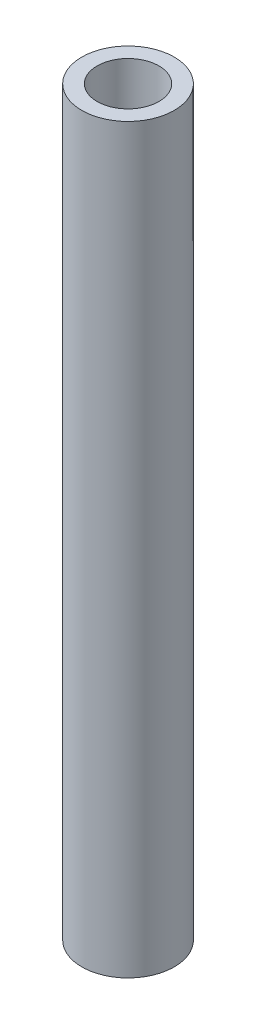
ISO-10303-21;
HEADER;
FILE_DESCRIPTION(('STEP AP214'),'2;1');
FILE_NAME('part.step','',(''),(''),'','','');
FILE_SCHEMA(('AUTOMOTIVE_DESIGN { 1 0 10303 214 1 1 1 1 }'));
ENDSEC;
DATA;
#1=APPLICATION_CONTEXT('core data for automotive mechanical design processes');
#2=APPLICATION_PROTOCOL_DEFINITION('international standard','automotive_design',2000,#1);
#3=PRODUCT_CONTEXT('',#1,'mechanical');
#4=PRODUCT('Part','Part','',(#3));
#5=PRODUCT_RELATED_PRODUCT_CATEGORY('part','',(#4));
#6=PRODUCT_DEFINITION_FORMATION('','',#4);
#7=PRODUCT_DEFINITION_CONTEXT('part definition',#1,'design');
#8=PRODUCT_DEFINITION('design','',#6,#7);
#9=PRODUCT_DEFINITION_SHAPE('','',#8);
#10=(LENGTH_UNIT() NAMED_UNIT(*) SI_UNIT(.MILLI.,.METRE.));
#11=(NAMED_UNIT(*) PLANE_ANGLE_UNIT() SI_UNIT($,.RADIAN.));
#12=(NAMED_UNIT(*) SI_UNIT($,.STERADIAN.) SOLID_ANGLE_UNIT());
#13=UNCERTAINTY_MEASURE_WITH_UNIT(LENGTH_MEASURE(1.E-05),#10,'distance_accuracy_value','');
#14=(GEOMETRIC_REPRESENTATION_CONTEXT(3) GLOBAL_UNCERTAINTY_ASSIGNED_CONTEXT((#13)) GLOBAL_UNIT_ASSIGNED_CONTEXT((#10,
#11,#12)) REPRESENTATION_CONTEXT('',''));
#15=CARTESIAN_POINT('',(0.,0.,0.));
#16=DIRECTION('',(0.,0.,1.));
#17=DIRECTION('',(1.,0.,0.));
#18=AXIS2_PLACEMENT_3D('',#15,#16,#17);
#19=CARTESIAN_POINT('',(0.,38.1,0.));
#20=DIRECTION('',(0.,-1.,0.));
#21=DIRECTION('',(0.,0.,-1.));
#22=AXIS2_PLACEMENT_3D('',#19,#20,#21);
#23=CYLINDRICAL_SURFACE('',#22,2.3749);
#24=CARTESIAN_POINT('',(0.,38.1,0.));
#25=DIRECTION('',(0.,1.,0.));
#26=DIRECTION('',(0.,0.,1.));
#27=AXIS2_PLACEMENT_3D('',#24,#25,#26);
#28=CIRCLE('',#27,2.3749);
#29=CARTESIAN_POINT('',(0.,38.1,-2.3749));
#30=VERTEX_POINT('',#29);
#31=EDGE_CURVE('E10',#30,#30,#28,.T.);
#32=CARTESIAN_POINT('',(0.,0.,0.));
#33=DIRECTION('',(0.,1.,0.));
#34=DIRECTION('',(0.,0.,1.));
#35=AXIS2_PLACEMENT_3D('',#32,#33,#34);
#36=CIRCLE('',#35,2.3749);
#37=CARTESIAN_POINT('',(0.,0.,-2.3749));
#38=VERTEX_POINT('',#37);
#39=EDGE_CURVE('E40',#38,#38,#36,.T.);
#40=CARTESIAN_POINT('',(0.,38.1,-2.3749));
#41=CARTESIAN_POINT('',(0.,37.703125,-2.3749));
#42=CARTESIAN_POINT('',(0.,37.30625,-2.3749));
#43=CARTESIAN_POINT('',(0.,36.5125,-2.3749));
#44=CARTESIAN_POINT('',(0.,36.115625,-2.3749));
#45=CARTESIAN_POINT('',(0.,35.321875,-2.3749));
#46=CARTESIAN_POINT('',(0.,34.925,-2.3749));
#47=CARTESIAN_POINT('',(0.,34.13125,-2.3749));
#48=CARTESIAN_POINT('',(0.,33.734375,-2.3749));
#49=CARTESIAN_POINT('',(0.,32.940625,-2.3749));
#50=CARTESIAN_POINT('',(0.,32.54375,-2.3749));
#51=CARTESIAN_POINT('',(0.,31.75,-2.3749));
#52=CARTESIAN_POINT('',(0.,31.353125,-2.3749));
#53=CARTESIAN_POINT('',(0.,30.559375,-2.3749));
#54=CARTESIAN_POINT('',(0.,30.1625,-2.3749));
#55=CARTESIAN_POINT('',(0.,29.36875,-2.3749));
#56=CARTESIAN_POINT('',(0.,28.971875,-2.3749));
#57=CARTESIAN_POINT('',(0.,28.178125,-2.3749));
#58=CARTESIAN_POINT('',(0.,27.78125,-2.3749));
#59=CARTESIAN_POINT('',(0.,26.9875,-2.3749));
#60=CARTESIAN_POINT('',(0.,26.590625,-2.3749));
#61=CARTESIAN_POINT('',(0.,25.796875,-2.3749));
#62=CARTESIAN_POINT('',(0.,25.4,-2.3749));
#63=CARTESIAN_POINT('',(0.,24.60625,-2.3749));
#64=CARTESIAN_POINT('',(0.,24.209375,-2.3749));
#65=CARTESIAN_POINT('',(0.,23.415625,-2.3749));
#66=CARTESIAN_POINT('',(0.,23.01875,-2.3749));
#67=CARTESIAN_POINT('',(0.,22.225,-2.3749));
#68=CARTESIAN_POINT('',(0.,21.828125,-2.3749));
#69=CARTESIAN_POINT('',(0.,21.034375,-2.3749));
#70=CARTESIAN_POINT('',(0.,20.6375,-2.3749));
#71=CARTESIAN_POINT('',(0.,19.84375,-2.3749));
#72=CARTESIAN_POINT('',(0.,19.446875,-2.3749));
#73=CARTESIAN_POINT('',(0.,18.653125,-2.3749));
#74=CARTESIAN_POINT('',(0.,18.25625,-2.3749));
#75=CARTESIAN_POINT('',(0.,17.4625,-2.3749));
#76=CARTESIAN_POINT('',(0.,17.065625,-2.3749));
#77=CARTESIAN_POINT('',(0.,16.271875,-2.3749));
#78=CARTESIAN_POINT('',(0.,15.875,-2.3749));
#79=CARTESIAN_POINT('',(0.,15.08125,-2.3749));
#80=CARTESIAN_POINT('',(0.,14.684375,-2.3749));
#81=CARTESIAN_POINT('',(0.,13.890625,-2.3749));
#82=CARTESIAN_POINT('',(0.,13.49375,-2.3749));
#83=CARTESIAN_POINT('',(0.,12.7,-2.3749));
#84=CARTESIAN_POINT('',(0.,12.303125,-2.3749));
#85=CARTESIAN_POINT('',(0.,11.509375,-2.3749));
#86=CARTESIAN_POINT('',(0.,11.1125,-2.3749));
#87=CARTESIAN_POINT('',(0.,10.31875,-2.3749));
#88=CARTESIAN_POINT('',(0.,9.921875,-2.3749));
#89=CARTESIAN_POINT('',(0.,9.128125,-2.3749));
#90=CARTESIAN_POINT('',(0.,8.73125,-2.3749));
#91=CARTESIAN_POINT('',(0.,7.9375,-2.3749));
#92=CARTESIAN_POINT('',(0.,7.540625,-2.3749));
#93=CARTESIAN_POINT('',(0.,6.746875,-2.3749));
#94=CARTESIAN_POINT('',(0.,6.35,-2.3749));
#95=CARTESIAN_POINT('',(0.,5.55625,-2.3749));
#96=CARTESIAN_POINT('',(0.,5.159375,-2.3749));
#97=CARTESIAN_POINT('',(0.,4.365625,-2.3749));
#98=CARTESIAN_POINT('',(0.,3.96875,-2.3749));
#99=CARTESIAN_POINT('',(0.,3.175,-2.3749));
#100=CARTESIAN_POINT('',(0.,2.778125,-2.3749));
#101=CARTESIAN_POINT('',(0.,1.984375,-2.3749));
#102=CARTESIAN_POINT('',(0.,1.5875,-2.3749));
#103=CARTESIAN_POINT('',(0.,0.79375,-2.3749));
#104=CARTESIAN_POINT('',(0.,0.396875,-2.3749));
#105=CARTESIAN_POINT('',(0.,0.,-2.3749));
#106=B_SPLINE_CURVE_WITH_KNOTS('',3,(#40,#41,#42,#43,#44,#45,#46,#47,#48,#49,#50,#51,#52,#53,
#54,#55,#56,#57,#58,#59,#60,#61,#62,#63,#64,#65,#66,#67,#68,#69,#70,#71,#72,#73,#74,#75,#76,#77,
#78,#79,#80,#81,#82,#83,#84,#85,#86,#87,#88,#89,#90,#91,#92,#93,#94,#95,#96,#97,#98,#99,#100,
#101,#102,#103,#104,#105),.UNSPECIFIED.,.F.,.F.,(4,2,2,2,2,2,2,2,2,2,2,2,2,2,2,2,2,2,2,2,2,2,2,
2,2,2,2,2,2,2,2,2,4),(0.,1.19062499999999,2.38124999999999,3.571875,4.7625,5.953125,7.14375,
8.33437499999999,9.525,10.715625,11.90625,13.096875,14.2875,15.478125,16.66875,17.859375,19.05,
20.240625,21.43125,22.621875,23.8125,25.003125,26.19375,27.384375,28.575,29.765625,30.95625,
32.146875,33.3375,34.528125,35.71875,36.909375,38.1),.UNSPECIFIED.);
#107=EDGE_CURVE('BSEAM37',#30,#38,#106,.T.);
#108=ORIENTED_EDGE('',*,*,#31,.F.);
#109=ORIENTED_EDGE('',*,*,#39,.T.);
#110=ORIENTED_EDGE('',*,*,#107,.T.);
#111=ORIENTED_EDGE('',*,*,#107,.F.);
#112=EDGE_LOOP('',(#108,#110,#109,#111));
#113=FACE_BOUND('',#112,.T.);
#114=ADVANCED_FACE('F37',(#113),#23,.T.);
#115=CARTESIAN_POINT('',(0.,38.1,0.));
#116=DIRECTION('',(0.,1.,0.));
#117=DIRECTION('',(0.,0.,1.));
#118=AXIS2_PLACEMENT_3D('',#115,#116,#117);
#119=PLANE('',#118);
#120=CARTESIAN_POINT('',(0.,38.1,0.));
#121=DIRECTION('',(0.,1.,0.));
#122=DIRECTION('',(0.,0.,1.));
#123=AXIS2_PLACEMENT_3D('',#120,#121,#122);
#124=CIRCLE('',#123,1.5875);
#125=CARTESIAN_POINT('',(0.,38.1,1.5875));
#126=VERTEX_POINT('',#125);
#127=EDGE_CURVE('E51',#126,#126,#124,.T.);
#128=ORIENTED_EDGE('',*,*,#127,.F.);
#129=EDGE_LOOP('',(#128));
#130=FACE_BOUND('',#129,.T.);
#131=ORIENTED_EDGE('',*,*,#31,.T.);
#132=EDGE_LOOP('',(#131));
#133=FACE_BOUND('',#132,.T.);
#134=ADVANCED_FACE('F68',(#130,#133),#119,.T.);
#135=CARTESIAN_POINT('',(0.,0.,0.));
#136=DIRECTION('',(0.,1.,0.));
#137=DIRECTION('',(0.,0.,1.));
#138=AXIS2_PLACEMENT_3D('',#135,#136,#137);
#139=PLANE('',#138);
#140=CARTESIAN_POINT('',(0.,0.,0.));
#141=DIRECTION('',(0.,1.,0.));
#142=DIRECTION('',(0.,0.,1.));
#143=AXIS2_PLACEMENT_3D('',#140,#141,#142);
#144=CIRCLE('',#143,1.5875);
#145=CARTESIAN_POINT('',(0.,0.,1.5875));
#146=VERTEX_POINT('',#145);
#147=EDGE_CURVE('E49',#146,#146,#144,.T.);
#148=ORIENTED_EDGE('',*,*,#147,.T.);
#149=EDGE_LOOP('',(#148));
#150=FACE_BOUND('',#149,.T.);
#151=ORIENTED_EDGE('',*,*,#39,.F.);
#152=EDGE_LOOP('',(#151));
#153=FACE_BOUND('',#152,.T.);
#154=ADVANCED_FACE('F59',(#150,#153),#139,.F.);
#155=CARTESIAN_POINT('',(0.,0.,0.));
#156=DIRECTION('',(0.,1.,0.));
#157=DIRECTION('',(0.,0.,1.));
#158=AXIS2_PLACEMENT_3D('',#155,#156,#157);
#159=CYLINDRICAL_SURFACE('',#158,1.5875);
#160=CARTESIAN_POINT('',(0.,0.,1.5875));
#161=CARTESIAN_POINT('',(0.,0.396875,1.5875));
#162=CARTESIAN_POINT('',(0.,0.79375,1.5875));
#163=CARTESIAN_POINT('',(0.,1.5875,1.5875));
#164=CARTESIAN_POINT('',(0.,1.984375,1.5875));
#165=CARTESIAN_POINT('',(0.,2.778125,1.5875));
#166=CARTESIAN_POINT('',(0.,3.175,1.5875));
#167=CARTESIAN_POINT('',(0.,3.96875,1.5875));
#168=CARTESIAN_POINT('',(0.,4.365625,1.5875));
#169=CARTESIAN_POINT('',(0.,5.159375,1.5875));
#170=CARTESIAN_POINT('',(0.,5.55625,1.5875));
#171=CARTESIAN_POINT('',(0.,6.35,1.5875));
#172=CARTESIAN_POINT('',(0.,6.746875,1.5875));
#173=CARTESIAN_POINT('',(0.,7.540625,1.5875));
#174=CARTESIAN_POINT('',(0.,7.9375,1.5875));
#175=CARTESIAN_POINT('',(0.,8.73125,1.5875));
#176=CARTESIAN_POINT('',(0.,9.128125,1.5875));
#177=CARTESIAN_POINT('',(0.,9.921875,1.5875));
#178=CARTESIAN_POINT('',(0.,10.31875,1.5875));
#179=CARTESIAN_POINT('',(0.,11.1125,1.5875));
#180=CARTESIAN_POINT('',(0.,11.509375,1.5875));
#181=CARTESIAN_POINT('',(0.,12.303125,1.5875));
#182=CARTESIAN_POINT('',(0.,12.7,1.5875));
#183=CARTESIAN_POINT('',(0.,13.49375,1.5875));
#184=CARTESIAN_POINT('',(0.,13.890625,1.5875));
#185=CARTESIAN_POINT('',(0.,14.684375,1.5875));
#186=CARTESIAN_POINT('',(0.,15.08125,1.5875));
#187=CARTESIAN_POINT('',(0.,15.875,1.5875));
#188=CARTESIAN_POINT('',(0.,16.271875,1.5875));
#189=CARTESIAN_POINT('',(0.,17.065625,1.5875));
#190=CARTESIAN_POINT('',(0.,17.4625,1.5875));
#191=CARTESIAN_POINT('',(0.,18.25625,1.5875));
#192=CARTESIAN_POINT('',(0.,18.653125,1.5875));
#193=CARTESIAN_POINT('',(0.,19.446875,1.5875));
#194=CARTESIAN_POINT('',(0.,19.84375,1.5875));
#195=CARTESIAN_POINT('',(0.,20.6375,1.5875));
#196=CARTESIAN_POINT('',(0.,21.034375,1.5875));
#197=CARTESIAN_POINT('',(0.,21.828125,1.5875));
#198=CARTESIAN_POINT('',(0.,22.225,1.5875));
#199=CARTESIAN_POINT('',(0.,23.01875,1.5875));
#200=CARTESIAN_POINT('',(0.,23.415625,1.5875));
#201=CARTESIAN_POINT('',(0.,24.209375,1.5875));
#202=CARTESIAN_POINT('',(0.,24.60625,1.5875));
#203=CARTESIAN_POINT('',(0.,25.4,1.5875));
#204=CARTESIAN_POINT('',(0.,25.796875,1.5875));
#205=CARTESIAN_POINT('',(0.,26.590625,1.5875));
#206=CARTESIAN_POINT('',(0.,26.9875,1.5875));
#207=CARTESIAN_POINT('',(0.,27.78125,1.5875));
#208=CARTESIAN_POINT('',(0.,28.178125,1.5875));
#209=CARTESIAN_POINT('',(0.,28.971875,1.5875));
#210=CARTESIAN_POINT('',(0.,29.36875,1.5875));
#211=CARTESIAN_POINT('',(0.,30.1625,1.5875));
#212=CARTESIAN_POINT('',(0.,30.559375,1.5875));
#213=CARTESIAN_POINT('',(0.,31.353125,1.5875));
#214=CARTESIAN_POINT('',(0.,31.75,1.5875));
#215=CARTESIAN_POINT('',(0.,32.54375,1.5875));
#216=CARTESIAN_POINT('',(0.,32.940625,1.5875));
#217=CARTESIAN_POINT('',(0.,33.734375,1.5875));
#218=CARTESIAN_POINT('',(0.,34.13125,1.5875));
#219=CARTESIAN_POINT('',(0.,34.925,1.5875));
#220=CARTESIAN_POINT('',(0.,35.321875,1.5875));
#221=CARTESIAN_POINT('',(0.,36.115625,1.5875));
#222=CARTESIAN_POINT('',(0.,36.5125,1.5875));
#223=CARTESIAN_POINT('',(0.,37.30625,1.5875));
#224=CARTESIAN_POINT('',(0.,37.703125,1.5875));
#225=CARTESIAN_POINT('',(0.,38.1,1.5875));
#226=B_SPLINE_CURVE_WITH_KNOTS('',3,(#160,#161,#162,#163,#164,#165,#166,#167,#168,#169,#170,
#171,#172,#173,#174,#175,#176,#177,#178,#179,#180,#181,#182,#183,#184,#185,#186,#187,#188,#189,
#190,#191,#192,#193,#194,#195,#196,#197,#198,#199,#200,#201,#202,#203,#204,#205,#206,#207,#208,
#209,#210,#211,#212,#213,#214,#215,#216,#217,#218,#219,#220,#221,#222,#223,#224,#225),
.UNSPECIFIED.,.F.,.F.,(4,2,2,2,2,2,2,2,2,2,2,2,2,2,2,2,2,2,2,2,2,2,2,2,2,2,2,2,2,2,2,2,4),(0.,
1.190625,2.38125,3.571875,4.7625,5.953125,7.14375,8.334375,9.525,10.715625,11.90625,13.096875,
14.2875,15.478125,16.66875,17.859375,19.05,20.240625,21.43125,22.621875,23.8125,25.003125,
26.19375,27.384375,28.575,29.765625,30.95625,32.146875,33.3375,34.528125,35.71875,36.909375,
38.1),.UNSPECIFIED.);
#227=EDGE_CURVE('BSEAM62',#146,#126,#226,.T.);
#228=ORIENTED_EDGE('',*,*,#147,.F.);
#229=ORIENTED_EDGE('',*,*,#127,.T.);
#230=ORIENTED_EDGE('',*,*,#227,.T.);
#231=ORIENTED_EDGE('',*,*,#227,.F.);
#232=EDGE_LOOP('',(#228,#230,#229,#231));
#233=FACE_BOUND('',#232,.T.);
#234=ADVANCED_FACE('F62',(#233),#159,.F.);
#235=CLOSED_SHELL('',(#114,#134,#154,#234));
#236=MANIFOLD_SOLID_BREP('B2',#235);
#237=ADVANCED_BREP_SHAPE_REPRESENTATION('',(#18,#236),#14);
#238=SHAPE_DEFINITION_REPRESENTATION(#9,#237);
ENDSEC;
END-ISO-10303-21;
